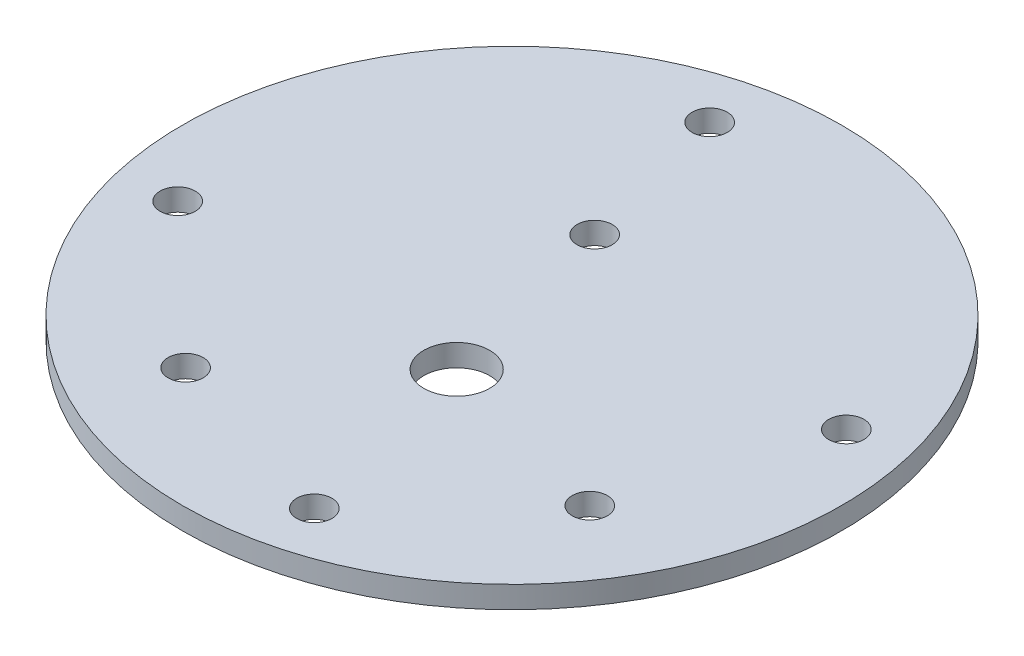
ISO-10303-21;
HEADER;
FILE_DESCRIPTION(('STEP AP214'),'2;1');
FILE_NAME('part.step','',(''),(''),'','','');
FILE_SCHEMA(('AUTOMOTIVE_DESIGN { 1 0 10303 214 1 1 1 1 }'));
ENDSEC;
DATA;
#1=APPLICATION_CONTEXT('core data for automotive mechanical design processes');
#2=APPLICATION_PROTOCOL_DEFINITION('international standard','automotive_design',2000,#1);
#3=PRODUCT_CONTEXT('',#1,'mechanical');
#4=PRODUCT('Part','Part','',(#3));
#5=PRODUCT_RELATED_PRODUCT_CATEGORY('part','',(#4));
#6=PRODUCT_DEFINITION_FORMATION('','',#4);
#7=PRODUCT_DEFINITION_CONTEXT('part definition',#1,'design');
#8=PRODUCT_DEFINITION('design','',#6,#7);
#9=PRODUCT_DEFINITION_SHAPE('','',#8);
#10=(LENGTH_UNIT() NAMED_UNIT(*) SI_UNIT(.MILLI.,.METRE.));
#11=(NAMED_UNIT(*) PLANE_ANGLE_UNIT() SI_UNIT($,.RADIAN.));
#12=(NAMED_UNIT(*) SI_UNIT($,.STERADIAN.) SOLID_ANGLE_UNIT());
#13=UNCERTAINTY_MEASURE_WITH_UNIT(LENGTH_MEASURE(1.E-05),#10,'distance_accuracy_value','');
#14=(GEOMETRIC_REPRESENTATION_CONTEXT(3) GLOBAL_UNCERTAINTY_ASSIGNED_CONTEXT((#13)) GLOBAL_UNIT_ASSIGNED_CONTEXT((#10,
#11,#12)) REPRESENTATION_CONTEXT('',''));
#15=CARTESIAN_POINT('',(0.,0.,0.));
#16=DIRECTION('',(0.,0.,1.));
#17=DIRECTION('',(1.,0.,0.));
#18=AXIS2_PLACEMENT_3D('',#15,#16,#17);
#19=CARTESIAN_POINT('',(-1.74081619021044,2.,-6.77654783454187));
#20=DIRECTION('',(0.,1.,0.));
#21=DIRECTION('',(0.,0.,1.));
#22=AXIS2_PLACEMENT_3D('',#19,#20,#21);
#23=PLANE('',#22);
#24=CARTESIAN_POINT('',(22.4732009113725,2.,-12.9959831629499));
#25=DIRECTION('',(0.,1.,0.));
#26=DIRECTION('',(0.,0.,1.));
#27=AXIS2_PLACEMENT_3D('',#24,#25,#26);
#28=CIRCLE('',#27,1.6);
#29=CARTESIAN_POINT('',(22.4732009113725,2.,-11.3959831629499));
#30=VERTEX_POINT('',#29);
#31=EDGE_CURVE('E79',#30,#30,#28,.T.);
#32=ORIENTED_EDGE('',*,*,#31,.F.);
#33=EDGE_LOOP('',(#32));
#34=FACE_BOUND('',#33,.T.);
#35=CARTESIAN_POINT('',(-7.96025151861844,2.,-30.9905649361248));
#36=DIRECTION('',(0.,1.,0.));
#37=DIRECTION('',(0.,0.,1.));
#38=AXIS2_PLACEMENT_3D('',#35,#36,#37);
#39=CIRCLE('',#38,1.60000000000001);
#40=CARTESIAN_POINT('',(-7.96025151861844,2.,-29.3905649361248));
#41=VERTEX_POINT('',#40);
#42=EDGE_CURVE('E67',#41,#41,#39,.T.);
#43=ORIENTED_EDGE('',*,*,#42,.F.);
#44=EDGE_LOOP('',(#43));
#45=FACE_BOUND('',#44,.T.);
#46=CARTESIAN_POINT('',(-4.34173131566798,2.,-16.9012386878159));
#47=DIRECTION('',(0.,1.,0.));
#48=DIRECTION('',(0.,0.,1.));
#49=AXIS2_PLACEMENT_3D('',#46,#47,#48);
#50=CIRCLE('',#49,1.6);
#51=CARTESIAN_POINT('',(-4.34173131566798,2.,-15.3012386878159));
#52=VERTEX_POINT('',#51);
#53=EDGE_CURVE('E55',#52,#52,#50,.T.);
#54=ORIENTED_EDGE('',*,*,#53,.F.);
#55=EDGE_LOOP('',(#54));
#56=FACE_BOUND('',#55,.T.);
#57=CARTESIAN_POINT('',(-12.466036401239,2.,12.2106689596829));
#58=DIRECTION('',(0.,1.,0.));
#59=DIRECTION('',(0.,0.,1.));
#60=AXIS2_PLACEMENT_3D('',#57,#58,#59);
#61=CIRCLE('',#60,1.6);
#62=CARTESIAN_POINT('',(-12.466036401239,2.,13.8106689596829));
#63=VERTEX_POINT('',#62);
#64=EDGE_CURVE('E44',#63,#63,#61,.T.);
#65=ORIENTED_EDGE('',*,*,#64,.F.);
#66=EDGE_LOOP('',(#65));
#67=FACE_BOUND('',#66,.T.);
#68=CARTESIAN_POINT('',(-1.74081619021044,2.,-6.77654783454187));
#69=DIRECTION('',(0.,1.,0.));
#70=DIRECTION('',(0.,0.,1.));
#71=AXIS2_PLACEMENT_3D('',#68,#69,#70);
#72=CIRCLE('',#71,29.9999999999906);
#73=CARTESIAN_POINT('',(-1.74081619021044,2.,23.2234521654487));
#74=VERTEX_POINT('',#73);
#75=EDGE_CURVE('E10',#74,#74,#72,.T.);
#76=ORIENTED_EDGE('',*,*,#75,.T.);
#77=EDGE_LOOP('',(#76));
#78=FACE_BOUND('',#77,.T.);
#79=CARTESIAN_POINT('',(0.,2.,0.));
#80=DIRECTION('',(0.,1.,0.));
#81=DIRECTION('',(0.,0.,1.));
#82=AXIS2_PLACEMENT_3D('',#79,#80,#81);
#83=CIRCLE('',#82,3.);
#84=CARTESIAN_POINT('',(0.,2.,3.));
#85=VERTEX_POINT('',#84);
#86=EDGE_CURVE('E49',#85,#85,#83,.T.);
#87=ORIENTED_EDGE('',*,*,#86,.F.);
#88=EDGE_LOOP('',(#87));
#89=FACE_BOUND('',#88,.T.);
#90=CARTESIAN_POINT('',(16.8077677169069,2.,4.69056972813307));
#91=DIRECTION('',(0.,1.,0.));
#92=DIRECTION('',(0.,0.,1.));
#93=AXIS2_PLACEMENT_3D('',#90,#91,#92);
#94=CIRCLE('',#93,1.6);
#95=CARTESIAN_POINT('',(16.8077677169069,2.,6.29056972813307));
#96=VERTEX_POINT('',#95);
#97=EDGE_CURVE('E61',#96,#96,#94,.T.);
#98=ORIENTED_EDGE('',*,*,#97,.F.);
#99=EDGE_LOOP('',(#98));
#100=FACE_BOUND('',#99,.T.);
#101=CARTESIAN_POINT('',(4.47861913819757,2.,17.4374692670411));
#102=DIRECTION('',(0.,1.,0.));
#103=DIRECTION('',(0.,0.,1.));
#104=AXIS2_PLACEMENT_3D('',#101,#102,#103);
#105=CIRCLE('',#104,1.6);
#106=CARTESIAN_POINT('',(4.47861913819757,2.,19.0374692670411));
#107=VERTEX_POINT('',#106);
#108=EDGE_CURVE('E73',#107,#107,#105,.T.);
#109=ORIENTED_EDGE('',*,*,#108,.F.);
#110=EDGE_LOOP('',(#109));
#111=FACE_BOUND('',#110,.T.);
#112=CARTESIAN_POINT('',(-25.9548332917934,2.,-0.557112506133852));
#113=DIRECTION('',(0.,1.,0.));
#114=DIRECTION('',(0.,0.,1.));
#115=AXIS2_PLACEMENT_3D('',#112,#113,#114);
#116=CIRCLE('',#115,1.6);
#117=CARTESIAN_POINT('',(-25.9548332917934,2.,1.04288749386615));
#118=VERTEX_POINT('',#117);
#119=EDGE_CURVE('E85',#118,#118,#116,.T.);
#120=ORIENTED_EDGE('',*,*,#119,.F.);
#121=EDGE_LOOP('',(#120));
#122=FACE_BOUND('',#121,.T.);
#123=ADVANCED_FACE('F33',(#34,#45,#56,#67,#78,#89,#100,#111,#122),#23,.T.);
#124=CARTESIAN_POINT('',(-1.74081619021044,0.,-6.77654783454187));
#125=DIRECTION('',(0.,1.,0.));
#126=DIRECTION('',(0.,0.,1.));
#127=AXIS2_PLACEMENT_3D('',#124,#125,#126);
#128=PLANE('',#127);
#129=CARTESIAN_POINT('',(-1.74081619021044,0.,-6.77654783454187));
#130=DIRECTION('',(0.,1.,0.));
#131=DIRECTION('',(0.,0.,1.));
#132=AXIS2_PLACEMENT_3D('',#129,#130,#131);
#133=CIRCLE('',#132,29.9999999999906);
#134=CARTESIAN_POINT('',(-1.74081619021044,0.,23.2234521654487));
#135=VERTEX_POINT('',#134);
#136=EDGE_CURVE('E37',#135,#135,#133,.T.);
#137=ORIENTED_EDGE('',*,*,#136,.F.);
#138=EDGE_LOOP('',(#137));
#139=FACE_BOUND('',#138,.T.);
#140=CARTESIAN_POINT('',(-12.466036401239,0.,12.2106689596829));
#141=DIRECTION('',(0.,1.,0.));
#142=DIRECTION('',(0.,0.,1.));
#143=AXIS2_PLACEMENT_3D('',#140,#141,#142);
#144=CIRCLE('',#143,1.6);
#145=CARTESIAN_POINT('',(-12.466036401239,0.,13.8106689596829));
#146=VERTEX_POINT('',#145);
#147=EDGE_CURVE('E46',#146,#146,#144,.T.);
#148=ORIENTED_EDGE('',*,*,#147,.T.);
#149=EDGE_LOOP('',(#148));
#150=FACE_BOUND('',#149,.T.);
#151=CARTESIAN_POINT('',(0.,0.,0.));
#152=DIRECTION('',(0.,1.,0.));
#153=DIRECTION('',(0.,0.,1.));
#154=AXIS2_PLACEMENT_3D('',#151,#152,#153);
#155=CIRCLE('',#154,3.);
#156=CARTESIAN_POINT('',(0.,0.,3.));
#157=VERTEX_POINT('',#156);
#158=EDGE_CURVE('E52',#157,#157,#155,.T.);
#159=ORIENTED_EDGE('',*,*,#158,.T.);
#160=EDGE_LOOP('',(#159));
#161=FACE_BOUND('',#160,.T.);
#162=CARTESIAN_POINT('',(-4.34173131566798,0.,-16.9012386878159));
#163=DIRECTION('',(0.,1.,0.));
#164=DIRECTION('',(0.,0.,1.));
#165=AXIS2_PLACEMENT_3D('',#162,#163,#164);
#166=CIRCLE('',#165,1.6);
#167=CARTESIAN_POINT('',(-4.34173131566798,0.,-15.3012386878159));
#168=VERTEX_POINT('',#167);
#169=EDGE_CURVE('E58',#168,#168,#166,.T.);
#170=ORIENTED_EDGE('',*,*,#169,.T.);
#171=EDGE_LOOP('',(#170));
#172=FACE_BOUND('',#171,.T.);
#173=CARTESIAN_POINT('',(16.8077677169069,0.,4.69056972813307));
#174=DIRECTION('',(0.,1.,0.));
#175=DIRECTION('',(0.,0.,1.));
#176=AXIS2_PLACEMENT_3D('',#173,#174,#175);
#177=CIRCLE('',#176,1.6);
#178=CARTESIAN_POINT('',(16.8077677169069,0.,6.29056972813307));
#179=VERTEX_POINT('',#178);
#180=EDGE_CURVE('E64',#179,#179,#177,.T.);
#181=ORIENTED_EDGE('',*,*,#180,.T.);
#182=EDGE_LOOP('',(#181));
#183=FACE_BOUND('',#182,.T.);
#184=CARTESIAN_POINT('',(-7.96025151861844,0.,-30.9905649361248));
#185=DIRECTION('',(0.,1.,0.));
#186=DIRECTION('',(0.,0.,1.));
#187=AXIS2_PLACEMENT_3D('',#184,#185,#186);
#188=CIRCLE('',#187,1.60000000000001);
#189=CARTESIAN_POINT('',(-7.96025151861844,0.,-29.3905649361248));
#190=VERTEX_POINT('',#189);
#191=EDGE_CURVE('E70',#190,#190,#188,.T.);
#192=ORIENTED_EDGE('',*,*,#191,.T.);
#193=EDGE_LOOP('',(#192));
#194=FACE_BOUND('',#193,.T.);
#195=CARTESIAN_POINT('',(4.47861913819757,0.,17.4374692670411));
#196=DIRECTION('',(0.,1.,0.));
#197=DIRECTION('',(0.,0.,1.));
#198=AXIS2_PLACEMENT_3D('',#195,#196,#197);
#199=CIRCLE('',#198,1.6);
#200=CARTESIAN_POINT('',(4.47861913819757,0.,19.0374692670411));
#201=VERTEX_POINT('',#200);
#202=EDGE_CURVE('E76',#201,#201,#199,.T.);
#203=ORIENTED_EDGE('',*,*,#202,.T.);
#204=EDGE_LOOP('',(#203));
#205=FACE_BOUND('',#204,.T.);
#206=CARTESIAN_POINT('',(22.4732009113725,0.,-12.9959831629499));
#207=DIRECTION('',(0.,1.,0.));
#208=DIRECTION('',(0.,0.,1.));
#209=AXIS2_PLACEMENT_3D('',#206,#207,#208);
#210=CIRCLE('',#209,1.6);
#211=CARTESIAN_POINT('',(22.4732009113725,0.,-11.3959831629499));
#212=VERTEX_POINT('',#211);
#213=EDGE_CURVE('E82',#212,#212,#210,.T.);
#214=ORIENTED_EDGE('',*,*,#213,.T.);
#215=EDGE_LOOP('',(#214));
#216=FACE_BOUND('',#215,.T.);
#217=CARTESIAN_POINT('',(-25.9548332917934,0.,-0.557112506133852));
#218=DIRECTION('',(0.,1.,0.));
#219=DIRECTION('',(0.,0.,1.));
#220=AXIS2_PLACEMENT_3D('',#217,#218,#219);
#221=CIRCLE('',#220,1.6);
#222=CARTESIAN_POINT('',(-25.9548332917934,0.,1.04288749386615));
#223=VERTEX_POINT('',#222);
#224=EDGE_CURVE('E88',#223,#223,#221,.T.);
#225=ORIENTED_EDGE('',*,*,#224,.T.);
#226=EDGE_LOOP('',(#225));
#227=FACE_BOUND('',#226,.T.);
#228=ADVANCED_FACE('F98',(#139,#150,#161,#172,#183,#194,#205,#216,#227),#128,.F.);
#229=CARTESIAN_POINT('',(-1.74081619021044,2.,-6.77654783454187));
#230=DIRECTION('',(0.,-1.,0.));
#231=DIRECTION('',(0.,0.,-1.));
#232=AXIS2_PLACEMENT_3D('',#229,#230,#231);
#233=CYLINDRICAL_SURFACE('',#232,29.9999999999906);
#234=ORIENTED_EDGE('',*,*,#75,.F.);
#235=EDGE_LOOP('',(#234));
#236=FACE_BOUND('',#235,.T.);
#237=ORIENTED_EDGE('',*,*,#136,.T.);
#238=EDGE_LOOP('',(#237));
#239=FACE_BOUND('',#238,.T.);
#240=ADVANCED_FACE('F35',(#236,#239),#233,.T.);
#241=CARTESIAN_POINT('',(-12.466036401239,2.,12.2106689596829));
#242=DIRECTION('',(0.,-1.,0.));
#243=DIRECTION('',(0.,0.,-1.));
#244=AXIS2_PLACEMENT_3D('',#241,#242,#243);
#245=CYLINDRICAL_SURFACE('',#244,1.6);
#246=ORIENTED_EDGE('',*,*,#64,.T.);
#247=EDGE_LOOP('',(#246));
#248=FACE_BOUND('',#247,.T.);
#249=ORIENTED_EDGE('',*,*,#147,.F.);
#250=EDGE_LOOP('',(#249));
#251=FACE_BOUND('',#250,.T.);
#252=ADVANCED_FACE('F108',(#248,#251),#245,.F.);
#253=CARTESIAN_POINT('',(0.,2.,0.));
#254=DIRECTION('',(0.,-1.,0.));
#255=DIRECTION('',(0.,0.,-1.));
#256=AXIS2_PLACEMENT_3D('',#253,#254,#255);
#257=CYLINDRICAL_SURFACE('',#256,3.);
#258=ORIENTED_EDGE('',*,*,#86,.T.);
#259=EDGE_LOOP('',(#258));
#260=FACE_BOUND('',#259,.T.);
#261=ORIENTED_EDGE('',*,*,#158,.F.);
#262=EDGE_LOOP('',(#261));
#263=FACE_BOUND('',#262,.T.);
#264=ADVANCED_FACE('F111',(#260,#263),#257,.F.);
#265=CARTESIAN_POINT('',(-4.34173131566798,2.,-16.9012386878159));
#266=DIRECTION('',(0.,-1.,0.));
#267=DIRECTION('',(0.,0.,-1.));
#268=AXIS2_PLACEMENT_3D('',#265,#266,#267);
#269=CYLINDRICAL_SURFACE('',#268,1.6);
#270=ORIENTED_EDGE('',*,*,#53,.T.);
#271=EDGE_LOOP('',(#270));
#272=FACE_BOUND('',#271,.T.);
#273=ORIENTED_EDGE('',*,*,#169,.F.);
#274=EDGE_LOOP('',(#273));
#275=FACE_BOUND('',#274,.T.);
#276=ADVANCED_FACE('F115',(#272,#275),#269,.F.);
#277=CARTESIAN_POINT('',(16.8077677169069,2.,4.69056972813307));
#278=DIRECTION('',(0.,-1.,0.));
#279=DIRECTION('',(0.,0.,-1.));
#280=AXIS2_PLACEMENT_3D('',#277,#278,#279);
#281=CYLINDRICAL_SURFACE('',#280,1.6);
#282=ORIENTED_EDGE('',*,*,#97,.T.);
#283=EDGE_LOOP('',(#282));
#284=FACE_BOUND('',#283,.T.);
#285=ORIENTED_EDGE('',*,*,#180,.F.);
#286=EDGE_LOOP('',(#285));
#287=FACE_BOUND('',#286,.T.);
#288=ADVANCED_FACE('F119',(#284,#287),#281,.F.);
#289=CARTESIAN_POINT('',(-7.96025151861844,2.,-30.9905649361248));
#290=DIRECTION('',(0.,-1.,0.));
#291=DIRECTION('',(0.,0.,-1.));
#292=AXIS2_PLACEMENT_3D('',#289,#290,#291);
#293=CYLINDRICAL_SURFACE('',#292,1.60000000000001);
#294=ORIENTED_EDGE('',*,*,#42,.T.);
#295=EDGE_LOOP('',(#294));
#296=FACE_BOUND('',#295,.T.);
#297=ORIENTED_EDGE('',*,*,#191,.F.);
#298=EDGE_LOOP('',(#297));
#299=FACE_BOUND('',#298,.T.);
#300=ADVANCED_FACE('F123',(#296,#299),#293,.F.);
#301=CARTESIAN_POINT('',(4.47861913819757,2.,17.4374692670411));
#302=DIRECTION('',(0.,-1.,0.));
#303=DIRECTION('',(0.,0.,-1.));
#304=AXIS2_PLACEMENT_3D('',#301,#302,#303);
#305=CYLINDRICAL_SURFACE('',#304,1.6);
#306=ORIENTED_EDGE('',*,*,#108,.T.);
#307=EDGE_LOOP('',(#306));
#308=FACE_BOUND('',#307,.T.);
#309=ORIENTED_EDGE('',*,*,#202,.F.);
#310=EDGE_LOOP('',(#309));
#311=FACE_BOUND('',#310,.T.);
#312=ADVANCED_FACE('F127',(#308,#311),#305,.F.);
#313=CARTESIAN_POINT('',(22.4732009113725,2.,-12.9959831629499));
#314=DIRECTION('',(0.,-1.,0.));
#315=DIRECTION('',(0.,0.,-1.));
#316=AXIS2_PLACEMENT_3D('',#313,#314,#315);
#317=CYLINDRICAL_SURFACE('',#316,1.6);
#318=ORIENTED_EDGE('',*,*,#31,.T.);
#319=EDGE_LOOP('',(#318));
#320=FACE_BOUND('',#319,.T.);
#321=ORIENTED_EDGE('',*,*,#213,.F.);
#322=EDGE_LOOP('',(#321));
#323=FACE_BOUND('',#322,.T.);
#324=ADVANCED_FACE('F131',(#320,#323),#317,.F.);
#325=CARTESIAN_POINT('',(-25.9548332917934,2.,-0.557112506133852));
#326=DIRECTION('',(0.,-1.,0.));
#327=DIRECTION('',(0.,0.,-1.));
#328=AXIS2_PLACEMENT_3D('',#325,#326,#327);
#329=CYLINDRICAL_SURFACE('',#328,1.6);
#330=ORIENTED_EDGE('',*,*,#119,.T.);
#331=EDGE_LOOP('',(#330));
#332=FACE_BOUND('',#331,.T.);
#333=ORIENTED_EDGE('',*,*,#224,.F.);
#334=EDGE_LOOP('',(#333));
#335=FACE_BOUND('',#334,.T.);
#336=ADVANCED_FACE('F94',(#332,#335),#329,.F.);
#337=CLOSED_SHELL('',(#123,#228,#240,#252,#264,#276,#288,#300,#312,#324,#336));
#338=MANIFOLD_SOLID_BREP('B2',#337);
#339=ADVANCED_BREP_SHAPE_REPRESENTATION('',(#18,#338),#14);
#340=SHAPE_DEFINITION_REPRESENTATION(#9,#339);
ENDSEC;
END-ISO-10303-21;
